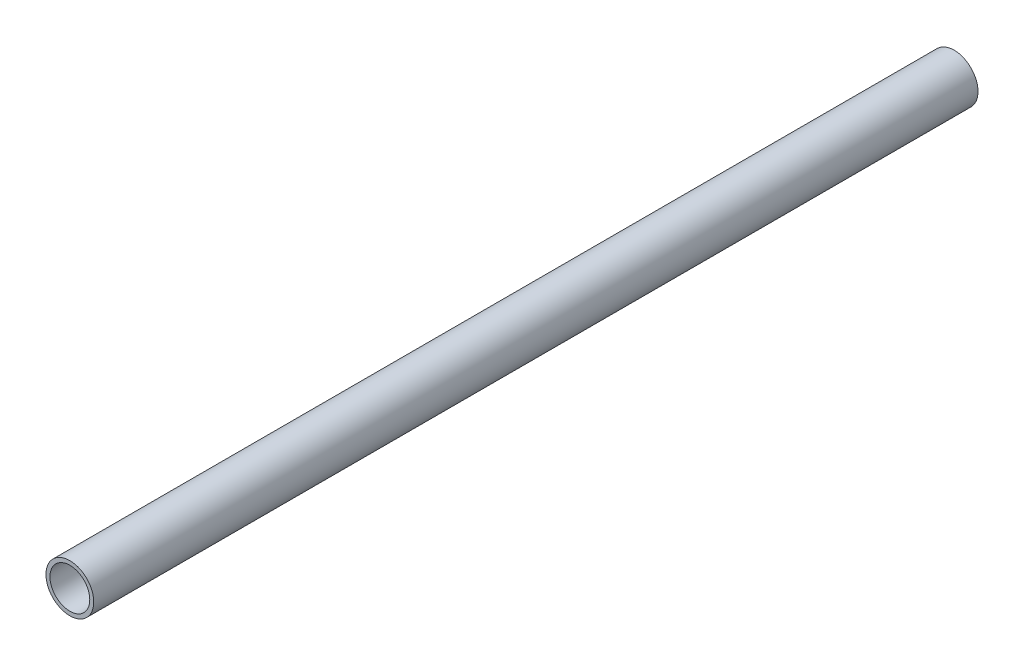
ISO-10303-21;
HEADER;
FILE_DESCRIPTION(('STEP AP214'),'2;1');
FILE_NAME('part.step','',(''),(''),'','','');
FILE_SCHEMA(('AUTOMOTIVE_DESIGN { 1 0 10303 214 1 1 1 1 }'));
ENDSEC;
DATA;
#1=APPLICATION_CONTEXT('core data for automotive mechanical design processes');
#2=APPLICATION_PROTOCOL_DEFINITION('international standard','automotive_design',2000,#1);
#3=PRODUCT_CONTEXT('',#1,'mechanical');
#4=PRODUCT('Part','Part','',(#3));
#5=PRODUCT_RELATED_PRODUCT_CATEGORY('part','',(#4));
#6=PRODUCT_DEFINITION_FORMATION('','',#4);
#7=PRODUCT_DEFINITION_CONTEXT('part definition',#1,'design');
#8=PRODUCT_DEFINITION('design','',#6,#7);
#9=PRODUCT_DEFINITION_SHAPE('','',#8);
#10=(LENGTH_UNIT() NAMED_UNIT(*) SI_UNIT(.MILLI.,.METRE.));
#11=(NAMED_UNIT(*) PLANE_ANGLE_UNIT() SI_UNIT($,.RADIAN.));
#12=(NAMED_UNIT(*) SI_UNIT($,.STERADIAN.) SOLID_ANGLE_UNIT());
#13=UNCERTAINTY_MEASURE_WITH_UNIT(LENGTH_MEASURE(1.E-05),#10,'distance_accuracy_value','');
#14=(GEOMETRIC_REPRESENTATION_CONTEXT(3) GLOBAL_UNCERTAINTY_ASSIGNED_CONTEXT((#13)) GLOBAL_UNIT_ASSIGNED_CONTEXT((#10,
#11,#12)) REPRESENTATION_CONTEXT('',''));
#15=CARTESIAN_POINT('',(0.,0.,0.));
#16=DIRECTION('',(0.,0.,1.));
#17=DIRECTION('',(1.,0.,0.));
#18=AXIS2_PLACEMENT_3D('',#15,#16,#17);
#19=CARTESIAN_POINT('',(0.,0.,333.));
#20=DIRECTION('',(0.,0.,1.));
#21=DIRECTION('',(1.,0.,0.));
#22=AXIS2_PLACEMENT_3D('',#19,#20,#21);
#23=PLANE('',#22);
#24=CARTESIAN_POINT('',(0.,0.,333.));
#25=DIRECTION('',(0.,0.,1.));
#26=DIRECTION('',(1.,0.,0.));
#27=AXIS2_PLACEMENT_3D('',#24,#25,#26);
#28=CIRCLE('',#27,9.);
#29=CARTESIAN_POINT('',(9.,0.,333.));
#30=VERTEX_POINT('',#29);
#31=EDGE_CURVE('E10',#30,#30,#28,.T.);
#32=ORIENTED_EDGE('',*,*,#31,.T.);
#33=EDGE_LOOP('',(#32));
#34=FACE_BOUND('',#33,.T.);
#35=CARTESIAN_POINT('',(0.,0.,333.));
#36=DIRECTION('',(0.,0.,1.));
#37=DIRECTION('',(1.,0.,0.));
#38=AXIS2_PLACEMENT_3D('',#35,#36,#37);
#39=CIRCLE('',#38,7.5);
#40=CARTESIAN_POINT('',(7.5,0.,333.));
#41=VERTEX_POINT('',#40);
#42=EDGE_CURVE('E42',#41,#41,#39,.T.);
#43=ORIENTED_EDGE('',*,*,#42,.F.);
#44=EDGE_LOOP('',(#43));
#45=FACE_BOUND('',#44,.T.);
#46=ADVANCED_FACE('F31',(#34,#45),#23,.T.);
#47=CARTESIAN_POINT('',(0.,0.,0.));
#48=DIRECTION('',(0.,0.,1.));
#49=DIRECTION('',(1.,0.,0.));
#50=AXIS2_PLACEMENT_3D('',#47,#48,#49);
#51=PLANE('',#50);
#52=CARTESIAN_POINT('',(0.,0.,0.));
#53=DIRECTION('',(0.,0.,1.));
#54=DIRECTION('',(1.,0.,0.));
#55=AXIS2_PLACEMENT_3D('',#52,#53,#54);
#56=CIRCLE('',#55,9.);
#57=CARTESIAN_POINT('',(9.,0.,0.));
#58=VERTEX_POINT('',#57);
#59=EDGE_CURVE('E35',#58,#58,#56,.T.);
#60=ORIENTED_EDGE('',*,*,#59,.F.);
#61=EDGE_LOOP('',(#60));
#62=FACE_BOUND('',#61,.T.);
#63=CARTESIAN_POINT('',(0.,0.,0.));
#64=DIRECTION('',(0.,0.,1.));
#65=DIRECTION('',(1.,0.,0.));
#66=AXIS2_PLACEMENT_3D('',#63,#64,#65);
#67=CIRCLE('',#66,7.5);
#68=CARTESIAN_POINT('',(7.5,0.,0.));
#69=VERTEX_POINT('',#68);
#70=EDGE_CURVE('E44',#69,#69,#67,.T.);
#71=ORIENTED_EDGE('',*,*,#70,.T.);
#72=EDGE_LOOP('',(#71));
#73=FACE_BOUND('',#72,.T.);
#74=ADVANCED_FACE('F54',(#62,#73),#51,.F.);
#75=CARTESIAN_POINT('',(0.,0.,333.));
#76=DIRECTION('',(0.,0.,-1.));
#77=DIRECTION('',(-1.,0.,0.));
#78=AXIS2_PLACEMENT_3D('',#75,#76,#77);
#79=CYLINDRICAL_SURFACE('',#78,9.);
#80=ORIENTED_EDGE('',*,*,#31,.F.);
#81=EDGE_LOOP('',(#80));
#82=FACE_BOUND('',#81,.T.);
#83=ORIENTED_EDGE('',*,*,#59,.T.);
#84=EDGE_LOOP('',(#83));
#85=FACE_BOUND('',#84,.T.);
#86=ADVANCED_FACE('F33',(#82,#85),#79,.T.);
#87=CARTESIAN_POINT('',(0.,0.,333.));
#88=DIRECTION('',(0.,0.,-1.));
#89=DIRECTION('',(-1.,0.,0.));
#90=AXIS2_PLACEMENT_3D('',#87,#88,#89);
#91=CYLINDRICAL_SURFACE('',#90,7.5);
#92=ORIENTED_EDGE('',*,*,#42,.T.);
#93=EDGE_LOOP('',(#92));
#94=FACE_BOUND('',#93,.T.);
#95=ORIENTED_EDGE('',*,*,#70,.F.);
#96=EDGE_LOOP('',(#95));
#97=FACE_BOUND('',#96,.T.);
#98=ADVANCED_FACE('F50',(#94,#97),#91,.F.);
#99=CLOSED_SHELL('',(#46,#74,#86,#98));
#100=MANIFOLD_SOLID_BREP('B2',#99);
#101=ADVANCED_BREP_SHAPE_REPRESENTATION('',(#18,#100),#14);
#102=SHAPE_DEFINITION_REPRESENTATION(#9,#101);
ENDSEC;
END-ISO-10303-21;
